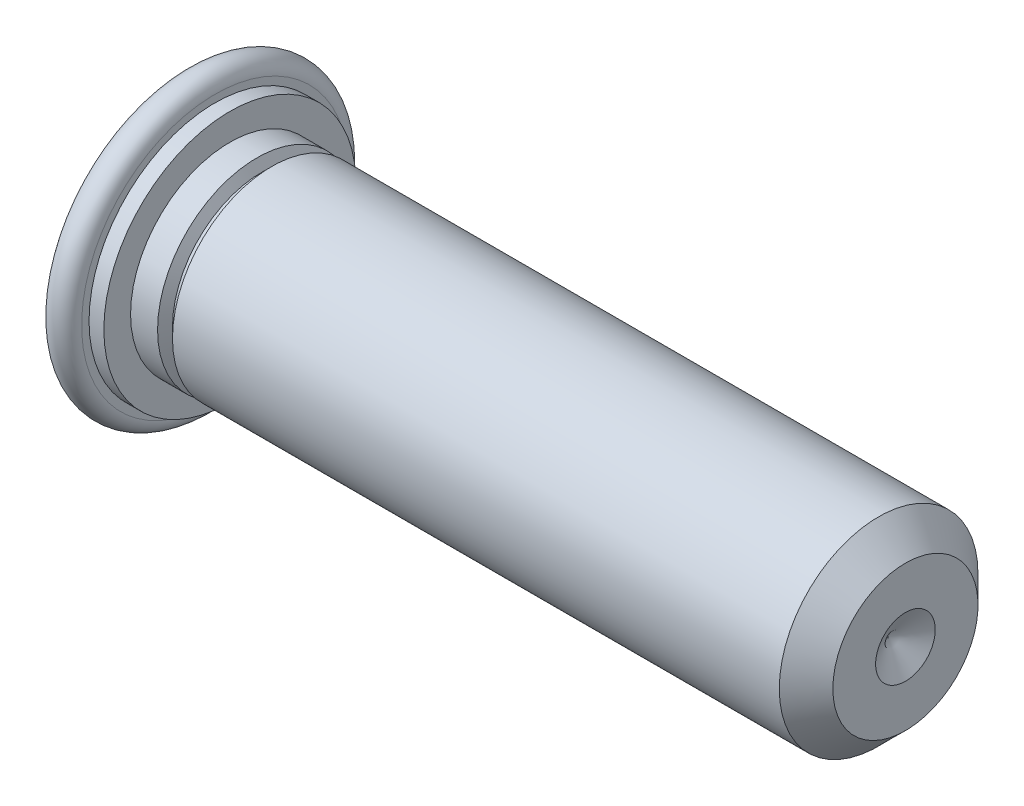
ISO-10303-21;
HEADER;
FILE_DESCRIPTION(('STEP AP214'),'2;1');
FILE_NAME('part.step','',(''),(''),'','','');
FILE_SCHEMA(('AUTOMOTIVE_DESIGN { 1 0 10303 214 1 1 1 1 }'));
ENDSEC;
DATA;
#1=APPLICATION_CONTEXT('core data for automotive mechanical design processes');
#2=APPLICATION_PROTOCOL_DEFINITION('international standard','automotive_design',2000,#1);
#3=PRODUCT_CONTEXT('',#1,'mechanical');
#4=PRODUCT('Part','Part','',(#3));
#5=PRODUCT_RELATED_PRODUCT_CATEGORY('part','',(#4));
#6=PRODUCT_DEFINITION_FORMATION('','',#4);
#7=PRODUCT_DEFINITION_CONTEXT('part definition',#1,'design');
#8=PRODUCT_DEFINITION('design','',#6,#7);
#9=PRODUCT_DEFINITION_SHAPE('','',#8);
#10=(LENGTH_UNIT() NAMED_UNIT(*) SI_UNIT(.MILLI.,.METRE.));
#11=(NAMED_UNIT(*) PLANE_ANGLE_UNIT() SI_UNIT($,.RADIAN.));
#12=(NAMED_UNIT(*) SI_UNIT($,.STERADIAN.) SOLID_ANGLE_UNIT());
#13=UNCERTAINTY_MEASURE_WITH_UNIT(LENGTH_MEASURE(1.E-05),#10,'distance_accuracy_value','');
#14=(GEOMETRIC_REPRESENTATION_CONTEXT(3) GLOBAL_UNCERTAINTY_ASSIGNED_CONTEXT((#13)) GLOBAL_UNIT_ASSIGNED_CONTEXT((#10,
#11,#12)) REPRESENTATION_CONTEXT('',''));
#15=CARTESIAN_POINT('',(0.,0.,0.));
#16=DIRECTION('',(0.,0.,1.));
#17=DIRECTION('',(1.,0.,0.));
#18=AXIS2_PLACEMENT_3D('',#15,#16,#17);
#19=CARTESIAN_POINT('',(12.396440775465,0.,0.));
#20=DIRECTION('',(1.,0.,0.));
#21=DIRECTION('',(0.,0.,-1.));
#22=AXIS2_PLACEMENT_3D('',#19,#20,#21);
#23=CONICAL_SURFACE('',#22,0.,1.04719755119593);
#24=CARTESIAN_POINT('',(12.396440775465,0.,0.));
#25=VERTEX_POINT('',#24);
#26=VERTEX_LOOP('',#25);
#27=FACE_BOUND('',#26,.T.);
#28=CARTESIAN_POINT('',(12.7,0.,0.));
#29=DIRECTION('',(1.,0.,0.));
#30=DIRECTION('',(0.,0.,-1.));
#31=AXIS2_PLACEMENT_3D('',#28,#29,#30);
#32=CIRCLE('',#31,0.525780000000002);
#33=CARTESIAN_POINT('',(12.7,0.,-0.525780000000002));
#34=VERTEX_POINT('',#33);
#35=EDGE_CURVE('E20',#34,#34,#32,.F.);
#36=ORIENTED_EDGE('',*,*,#35,.F.);
#37=EDGE_LOOP('',(#36));
#38=FACE_BOUND('',#37,.T.);
#39=ADVANCED_FACE('F16',(#27,#38),#23,.F.);
#40=CARTESIAN_POINT('',(12.7,-1.3057632,1.28016));
#41=DIRECTION('',(1.,0.,0.));
#42=DIRECTION('',(0.,0.,-1.));
#43=AXIS2_PLACEMENT_3D('',#40,#41,#42);
#44=PLANE('',#43);
#45=CARTESIAN_POINT('',(12.7,0.,0.));
#46=DIRECTION('',(-1.,0.,0.));
#47=DIRECTION('',(0.,0.,1.));
#48=AXIS2_PLACEMENT_3D('',#45,#46,#47);
#49=CIRCLE('',#48,1.28016);
#50=CARTESIAN_POINT('',(12.7,0.,1.28016));
#51=VERTEX_POINT('',#50);
#52=EDGE_CURVE('E35',#51,#51,#49,.T.);
#53=ORIENTED_EDGE('',*,*,#52,.F.);
#54=EDGE_LOOP('',(#53));
#55=FACE_BOUND('',#54,.T.);
#56=ORIENTED_EDGE('',*,*,#35,.T.);
#57=EDGE_LOOP('',(#56));
#58=FACE_BOUND('',#57,.T.);
#59=ADVANCED_FACE('F30',(#55,#58),#44,.T.);
#60=CARTESIAN_POINT('',(12.22756,0.,0.));
#61=DIRECTION('',(-1.,0.,0.));
#62=DIRECTION('',(0.,0.,1.));
#63=AXIS2_PLACEMENT_3D('',#60,#61,#62);
#64=CONICAL_SURFACE('',#63,1.7526,0.785398163397447);
#65=ORIENTED_EDGE('',*,*,#52,.T.);
#66=EDGE_LOOP('',(#65));
#67=FACE_BOUND('',#66,.T.);
#68=CARTESIAN_POINT('',(12.22756,0.,0.));
#69=DIRECTION('',(-1.,0.,0.));
#70=DIRECTION('',(0.,0.,1.));
#71=AXIS2_PLACEMENT_3D('',#68,#69,#70);
#72=CIRCLE('',#71,1.7526);
#73=CARTESIAN_POINT('',(12.22756,0.,1.7526));
#74=VERTEX_POINT('',#73);
#75=EDGE_CURVE('E37',#74,#74,#72,.T.);
#76=ORIENTED_EDGE('',*,*,#75,.F.);
#77=EDGE_LOOP('',(#76));
#78=FACE_BOUND('',#77,.T.);
#79=ADVANCED_FACE('F179',(#67,#78),#64,.T.);
#80=CARTESIAN_POINT('',(1.524,0.,0.));
#81=DIRECTION('',(1.,0.,0.));
#82=DIRECTION('',(0.,0.,-1.));
#83=AXIS2_PLACEMENT_3D('',#80,#81,#82);
#84=CYLINDRICAL_SURFACE('',#83,1.7526);
#85=ORIENTED_EDGE('',*,*,#75,.T.);
#86=EDGE_LOOP('',(#85));
#87=FACE_BOUND('',#86,.T.);
#88=CARTESIAN_POINT('',(1.524,0.,0.));
#89=DIRECTION('',(-1.,0.,0.));
#90=DIRECTION('',(0.,0.,1.));
#91=AXIS2_PLACEMENT_3D('',#88,#89,#90);
#92=CIRCLE('',#91,1.7526);
#93=CARTESIAN_POINT('',(1.524,0.,1.7526));
#94=VERTEX_POINT('',#93);
#95=EDGE_CURVE('E41',#94,#94,#92,.T.);
#96=ORIENTED_EDGE('',*,*,#95,.F.);
#97=EDGE_LOOP('',(#96));
#98=FACE_BOUND('',#97,.T.);
#99=ADVANCED_FACE('F85',(#87,#98),#84,.T.);
#100=CARTESIAN_POINT('',(1.43637,0.,0.));
#101=DIRECTION('',(1.,0.,0.));
#102=DIRECTION('',(0.,0.,-1.));
#103=AXIS2_PLACEMENT_3D('',#100,#101,#102);
#104=CONICAL_SURFACE('',#103,1.57734,1.10714871779409);
#105=CARTESIAN_POINT('',(1.43636999872999,0.,0.));
#106=DIRECTION('',(-1.,0.,0.));
#107=DIRECTION('',(0.,0.,1.));
#108=AXIS2_PLACEMENT_3D('',#105,#106,#107);
#109=CIRCLE('',#108,1.57734000219973);
#110=CARTESIAN_POINT('',(1.43636999872999,0.,1.57734000219973));
#111=VERTEX_POINT('',#110);
#112=EDGE_CURVE('E58',#111,#111,#109,.T.);
#113=ORIENTED_EDGE('',*,*,#112,.F.);
#114=EDGE_LOOP('',(#113));
#115=FACE_BOUND('',#114,.T.);
#116=ORIENTED_EDGE('',*,*,#95,.T.);
#117=EDGE_LOOP('',(#116));
#118=FACE_BOUND('',#117,.T.);
#119=ADVANCED_FACE('F78',(#115,#118),#104,.T.);
#120=CARTESIAN_POINT('',(1.392555,0.,0.));
#121=DIRECTION('',(1.,0.,0.));
#122=DIRECTION('',(0.,0.,-1.));
#123=AXIS2_PLACEMENT_3D('',#120,#121,#122);
#124=TOROIDAL_SURFACE('',#123,1.6532298090666,0.08763);
#125=ORIENTED_EDGE('',*,*,#112,.T.);
#126=EDGE_LOOP('',(#125));
#127=FACE_BOUND('',#126,.T.);
#128=CARTESIAN_POINT('',(1.34874000127,0.,0.));
#129=DIRECTION('',(-1.,0.,0.));
#130=DIRECTION('',(0.,0.,1.));
#131=AXIS2_PLACEMENT_3D('',#128,#129,#130);
#132=CIRCLE('',#131,1.5773399998299);
#133=CARTESIAN_POINT('',(1.34874000127,0.,1.5773399998299));
#134=VERTEX_POINT('',#133);
#135=EDGE_CURVE('E61',#134,#134,#132,.T.);
#136=ORIENTED_EDGE('',*,*,#135,.F.);
#137=EDGE_LOOP('',(#136));
#138=FACE_BOUND('',#137,.T.);
#139=ADVANCED_FACE('F73',(#127,#138),#124,.F.);
#140=CARTESIAN_POINT('',(1.26111,0.,0.));
#141=DIRECTION('',(-1.,0.,0.));
#142=DIRECTION('',(0.,0.,1.));
#143=AXIS2_PLACEMENT_3D('',#140,#141,#142);
#144=CONICAL_SURFACE('',#143,1.7526000023699,1.10714871779409);
#145=CARTESIAN_POINT('',(1.26111,0.,0.));
#146=DIRECTION('',(-1.,0.,0.));
#147=DIRECTION('',(0.,0.,1.));
#148=AXIS2_PLACEMENT_3D('',#145,#146,#147);
#149=CIRCLE('',#148,1.7526);
#150=CARTESIAN_POINT('',(1.26111,0.,1.7526));
#151=VERTEX_POINT('',#150);
#152=EDGE_CURVE('E48',#151,#151,#149,.T.);
#153=ORIENTED_EDGE('',*,*,#152,.F.);
#154=EDGE_LOOP('',(#153));
#155=FACE_BOUND('',#154,.T.);
#156=ORIENTED_EDGE('',*,*,#135,.T.);
#157=EDGE_LOOP('',(#156));
#158=FACE_BOUND('',#157,.T.);
#159=ADVANCED_FACE('F70',(#155,#158),#144,.T.);
#160=CARTESIAN_POINT('',(0.78486,0.,0.));
#161=DIRECTION('',(1.,0.,0.));
#162=DIRECTION('',(0.,0.,-1.));
#163=AXIS2_PLACEMENT_3D('',#160,#161,#162);
#164=CYLINDRICAL_SURFACE('',#163,1.7526);
#165=ORIENTED_EDGE('',*,*,#152,.T.);
#166=EDGE_LOOP('',(#165));
#167=FACE_BOUND('',#166,.T.);
#168=CARTESIAN_POINT('',(0.78486,0.,0.));
#169=DIRECTION('',(1.,0.,0.));
#170=DIRECTION('',(0.,0.,-1.));
#171=AXIS2_PLACEMENT_3D('',#168,#169,#170);
#172=CIRCLE('',#171,1.7526);
#173=CARTESIAN_POINT('',(0.78486,0.,-1.7526));
#174=VERTEX_POINT('',#173);
#175=EDGE_CURVE('E44',#174,#174,#172,.F.);
#176=ORIENTED_EDGE('',*,*,#175,.F.);
#177=EDGE_LOOP('',(#176));
#178=FACE_BOUND('',#177,.T.);
#179=ADVANCED_FACE('F67',(#167,#178),#164,.T.);
#180=CARTESIAN_POINT('',(0.78486,2.2682454,-2.22377));
#181=DIRECTION('',(1.,0.,0.));
#182=DIRECTION('',(0.,0.,1.));
#183=AXIS2_PLACEMENT_3D('',#180,#181,#182);
#184=PLANE('',#183);
#185=CARTESIAN_POINT('',(0.78486,0.,0.));
#186=DIRECTION('',(-1.,0.,0.));
#187=DIRECTION('',(0.,0.,1.));
#188=AXIS2_PLACEMENT_3D('',#185,#186,#187);
#189=CIRCLE('',#188,2.22377);
#190=CARTESIAN_POINT('',(0.78486,0.,2.22377));
#191=VERTEX_POINT('',#190);
#192=EDGE_CURVE('E47',#191,#191,#189,.T.);
#193=ORIENTED_EDGE('',*,*,#192,.F.);
#194=EDGE_LOOP('',(#193));
#195=FACE_BOUND('',#194,.T.);
#196=ORIENTED_EDGE('',*,*,#175,.T.);
#197=EDGE_LOOP('',(#196));
#198=FACE_BOUND('',#197,.T.);
#199=ADVANCED_FACE('F108',(#195,#198),#184,.T.);
#200=CARTESIAN_POINT('',(0.,-2.4016716,-2.35458));
#201=DIRECTION('',(-1.,0.,0.));
#202=DIRECTION('',(0.,0.,1.));
#203=AXIS2_PLACEMENT_3D('',#200,#201,#202);
#204=PLANE('',#203);
#205=CARTESIAN_POINT('',(2.54000038233185E-09,0.,0.));
#206=DIRECTION('',(1.,0.,0.));
#207=DIRECTION('',(0.,0.,-1.));
#208=AXIS2_PLACEMENT_3D('',#205,#206,#207);
#209=CIRCLE('',#208,2.35457999999659);
#210=CARTESIAN_POINT('',(2.54000038233185E-09,0.,-2.35457999999659));
#211=VERTEX_POINT('',#210);
#212=EDGE_CURVE('E51',#211,#211,#209,.T.);
#213=ORIENTED_EDGE('',*,*,#212,.F.);
#214=EDGE_LOOP('',(#213));
#215=FACE_BOUND('',#214,.T.);
#216=ADVANCED_FACE('F104',(#215),#204,.T.);
#217=CARTESIAN_POINT('',(0.78486,0.,0.));
#218=DIRECTION('',(-1.,0.,0.));
#219=DIRECTION('',(0.,0.,1.));
#220=AXIS2_PLACEMENT_3D('',#217,#218,#219);
#221=CYLINDRICAL_SURFACE('',#220,2.22377);
#222=CARTESIAN_POINT('',(0.52323999873,0.,0.));
#223=DIRECTION('',(-1.,0.,0.));
#224=DIRECTION('',(0.,0.,1.));
#225=AXIS2_PLACEMENT_3D('',#222,#223,#224);
#226=CIRCLE('',#225,2.22377);
#227=CARTESIAN_POINT('',(0.52323999873,0.,2.22377));
#228=VERTEX_POINT('',#227);
#229=EDGE_CURVE('E24',#228,#228,#226,.T.);
#230=ORIENTED_EDGE('',*,*,#229,.F.);
#231=EDGE_LOOP('',(#230));
#232=FACE_BOUND('',#231,.T.);
#233=ORIENTED_EDGE('',*,*,#192,.T.);
#234=EDGE_LOOP('',(#233));
#235=FACE_BOUND('',#234,.T.);
#236=ADVANCED_FACE('F94',(#232,#235),#221,.T.);
#237=CARTESIAN_POINT('',(0.52323999873,-2.40167160000041,2.3545800000004));
#238=DIRECTION('',(1.,0.,0.));
#239=DIRECTION('',(0.,0.,-1.));
#240=AXIS2_PLACEMENT_3D('',#237,#238,#239);
#241=PLANE('',#240);
#242=CARTESIAN_POINT('',(0.52323999746,0.,0.));
#243=DIRECTION('',(1.,0.,0.));
#244=DIRECTION('',(0.,0.,-1.));
#245=AXIS2_PLACEMENT_3D('',#242,#243,#244);
#246=CIRCLE('',#245,2.35457999999978);
#247=CARTESIAN_POINT('',(0.52323999746,0.,-2.35457999999978));
#248=VERTEX_POINT('',#247);
#249=EDGE_CURVE('E10',#248,#248,#246,.F.);
#250=ORIENTED_EDGE('',*,*,#249,.F.);
#251=EDGE_LOOP('',(#250));
#252=FACE_BOUND('',#251,.T.);
#253=ORIENTED_EDGE('',*,*,#229,.T.);
#254=EDGE_LOOP('',(#253));
#255=FACE_BOUND('',#254,.T.);
#256=ADVANCED_FACE('F89',(#252,#255),#241,.T.);
#257=CARTESIAN_POINT('',(0.26162,0.,0.));
#258=DIRECTION('',(1.,0.,0.));
#259=DIRECTION('',(0.,0.,-1.));
#260=AXIS2_PLACEMENT_3D('',#257,#258,#259);
#261=TOROIDAL_SURFACE('',#260,2.3546164558582,0.26162);
#262=ORIENTED_EDGE('',*,*,#212,.T.);
#263=EDGE_LOOP('',(#262));
#264=FACE_BOUND('',#263,.T.);
#265=ORIENTED_EDGE('',*,*,#249,.T.);
#266=EDGE_LOOP('',(#265));
#267=FACE_BOUND('',#266,.T.);
#268=ADVANCED_FACE('F18',(#264,#267),#261,.T.);
#269=CLOSED_SHELL('',(#39,#59,#79,#99,#119,#139,#159,#179,#199,#216,#236,#256,#268));
#270=MANIFOLD_SOLID_BREP('B1',#269);
#271=ADVANCED_BREP_SHAPE_REPRESENTATION('',(#18,#270),#14);
#272=SHAPE_DEFINITION_REPRESENTATION(#9,#271);
ENDSEC;
END-ISO-10303-21;
